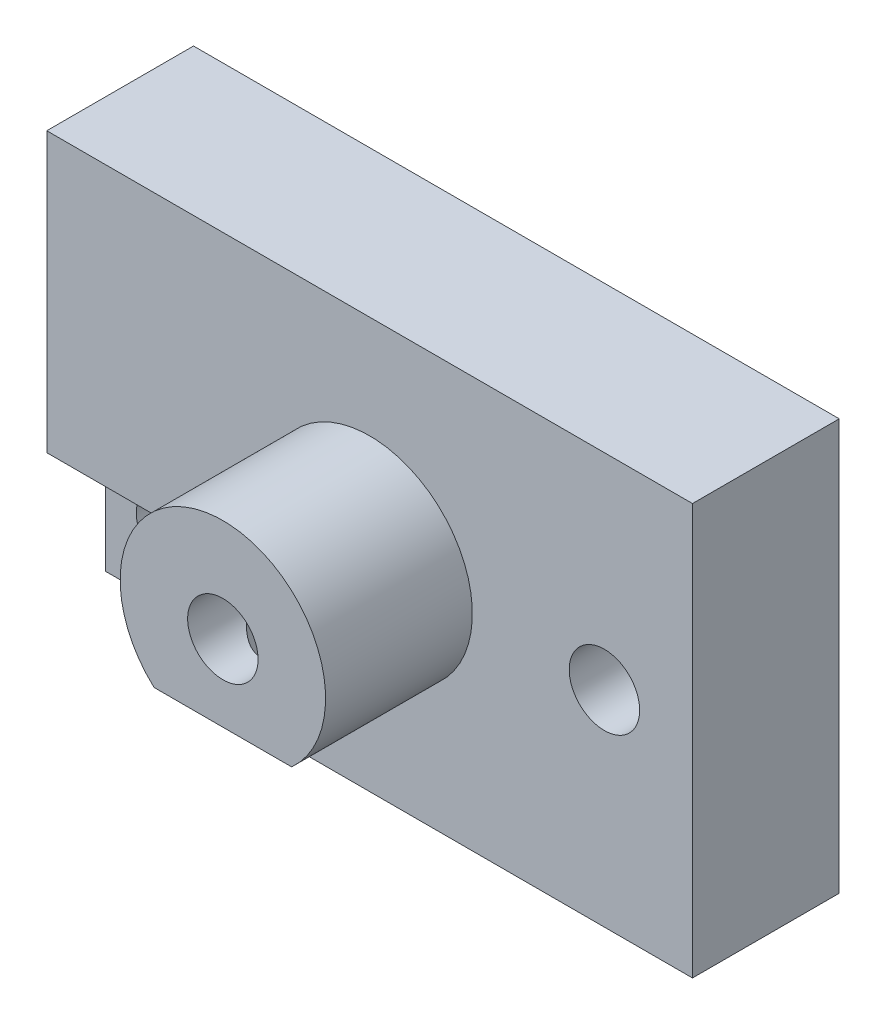
ISO-10303-21;
HEADER;
FILE_DESCRIPTION(('STEP AP214'),'2;1');
FILE_NAME('part.step','',(''),(''),'','','');
FILE_SCHEMA(('AUTOMOTIVE_DESIGN { 1 0 10303 214 1 1 1 1 }'));
ENDSEC;
DATA;
#1=APPLICATION_CONTEXT('core data for automotive mechanical design processes');
#2=APPLICATION_PROTOCOL_DEFINITION('international standard','automotive_design',2000,#1);
#3=PRODUCT_CONTEXT('',#1,'mechanical');
#4=PRODUCT('Part','Part','',(#3));
#5=PRODUCT_RELATED_PRODUCT_CATEGORY('part','',(#4));
#6=PRODUCT_DEFINITION_FORMATION('','',#4);
#7=PRODUCT_DEFINITION_CONTEXT('part definition',#1,'design');
#8=PRODUCT_DEFINITION('design','',#6,#7);
#9=PRODUCT_DEFINITION_SHAPE('','',#8);
#10=(LENGTH_UNIT() NAMED_UNIT(*) SI_UNIT(.MILLI.,.METRE.));
#11=(NAMED_UNIT(*) PLANE_ANGLE_UNIT() SI_UNIT($,.RADIAN.));
#12=(NAMED_UNIT(*) SI_UNIT($,.STERADIAN.) SOLID_ANGLE_UNIT());
#13=UNCERTAINTY_MEASURE_WITH_UNIT(LENGTH_MEASURE(1.E-05),#10,'distance_accuracy_value','');
#14=(GEOMETRIC_REPRESENTATION_CONTEXT(3) GLOBAL_UNCERTAINTY_ASSIGNED_CONTEXT((#13)) GLOBAL_UNIT_ASSIGNED_CONTEXT((#10,
#11,#12)) REPRESENTATION_CONTEXT('',''));
#15=CARTESIAN_POINT('',(0.,0.,0.));
#16=DIRECTION('',(0.,0.,1.));
#17=DIRECTION('',(1.,0.,0.));
#18=AXIS2_PLACEMENT_3D('',#15,#16,#17);
#19=CARTESIAN_POINT('',(0.,0.,25.));
#20=DIRECTION('',(0.,0.,-1.));
#21=DIRECTION('',(-1.,0.,0.));
#22=AXIS2_PLACEMENT_3D('',#19,#20,#21);
#23=PLANE('',#22);
#24=CARTESIAN_POINT('',(40.,0.,25.));
#25=DIRECTION('',(0.,0.,1.));
#26=DIRECTION('',(1.,0.,0.));
#27=AXIS2_PLACEMENT_3D('',#24,#25,#26);
#28=CIRCLE('',#27,5.99999999999999);
#29=CARTESIAN_POINT('',(46.,0.,25.));
#30=VERTEX_POINT('',#29);
#31=EDGE_CURVE('E127',#30,#30,#28,.T.);
#32=ORIENTED_EDGE('',*,*,#31,.F.);
#33=EDGE_LOOP('',(#32));
#34=FACE_BOUND('',#33,.T.);
#35=DIRECTION('',(-1.,0.,0.));
#36=VECTOR('',#35,1.);
#37=CARTESIAN_POINT('',(-77.5,-12.5,25.));
#38=LINE('',#37,#36);
#39=CARTESIAN_POINT('',(-32.5,-12.5,25.));
#40=VERTEX_POINT('',#39);
#41=CARTESIAN_POINT('',(-55.,-12.5,25.));
#42=VERTEX_POINT('',#41);
#43=EDGE_CURVE('E143',#40,#42,#38,.T.);
#44=ORIENTED_EDGE('',*,*,#43,.F.);
#45=DIRECTION('',(0.,1.,0.));
#46=VECTOR('',#45,1.);
#47=CARTESIAN_POINT('',(-32.5,-57.5,25.));
#48=LINE('',#47,#46);
#49=CARTESIAN_POINT('',(-32.5,-35.,25.));
#50=VERTEX_POINT('',#49);
#51=EDGE_CURVE('E137',#50,#40,#48,.T.);
#52=ORIENTED_EDGE('',*,*,#51,.F.);
#53=DIRECTION('',(1.,0.,0.));
#54=VECTOR('',#53,1.);
#55=CARTESIAN_POINT('',(-55.,-35.,25.));
#56=LINE('',#55,#54);
#57=CARTESIAN_POINT('',(55.,-35.,25.));
#58=VERTEX_POINT('',#57);
#59=EDGE_CURVE('E173',#50,#58,#56,.T.);
#60=ORIENTED_EDGE('',*,*,#59,.T.);
#61=DIRECTION('',(0.,1.,0.));
#62=VECTOR('',#61,1.);
#63=CARTESIAN_POINT('',(55.,-35.,25.));
#64=LINE('',#63,#62);
#65=CARTESIAN_POINT('',(55.,35.,25.));
#66=VERTEX_POINT('',#65);
#67=EDGE_CURVE('E164',#58,#66,#64,.T.);
#68=ORIENTED_EDGE('',*,*,#67,.T.);
#69=DIRECTION('',(-1.,0.,0.));
#70=VECTOR('',#69,1.);
#71=CARTESIAN_POINT('',(-55.,35.,25.));
#72=LINE('',#71,#70);
#73=CARTESIAN_POINT('',(-55.,35.,25.));
#74=VERTEX_POINT('',#73);
#75=EDGE_CURVE('E167',#66,#74,#72,.T.);
#76=ORIENTED_EDGE('',*,*,#75,.T.);
#77=DIRECTION('',(0.,-1.,0.));
#78=VECTOR('',#77,1.);
#79=CARTESIAN_POINT('',(-55.,-35.,25.));
#80=LINE('',#79,#78);
#81=EDGE_CURVE('E170',#74,#42,#80,.T.);
#82=ORIENTED_EDGE('',*,*,#81,.T.);
#83=EDGE_LOOP('',(#44,#52,#60,#68,#76,#82));
#84=FACE_BOUND('',#83,.T.);
#85=CARTESIAN_POINT('',(0.,0.,25.));
#86=DIRECTION('',(0.,0.,-1.));
#87=DIRECTION('',(-1.,0.,0.));
#88=AXIS2_PLACEMENT_3D('',#85,#86,#87);
#89=CIRCLE('',#88,17.5);
#90=CARTESIAN_POINT('',(11.71537451386,-13.,25.));
#91=VERTEX_POINT('',#90);
#92=CARTESIAN_POINT('',(-11.71537451386,-13.,25.));
#93=VERTEX_POINT('',#92);
#94=EDGE_CURVE('E194',#91,#93,#89,.F.);
#95=ORIENTED_EDGE('',*,*,#94,.F.);
#96=DIRECTION('',(-1.,0.,0.));
#97=VECTOR('',#96,1.);
#98=CARTESIAN_POINT('',(-11.71537451386,-13.,25.));
#99=LINE('',#98,#97);
#100=EDGE_CURVE('E120',#91,#93,#99,.T.);
#101=ORIENTED_EDGE('',*,*,#100,.T.);
#102=EDGE_LOOP('',(#95,#101));
#103=FACE_BOUND('',#102,.T.);
#104=ADVANCED_FACE('F33',(#34,#84,#103),#23,.F.);
#105=CARTESIAN_POINT('',(55.,-35.,25.));
#106=DIRECTION('',(-1.,0.,0.));
#107=DIRECTION('',(0.,0.,1.));
#108=AXIS2_PLACEMENT_3D('',#105,#106,#107);
#109=PLANE('',#108);
#110=DIRECTION('',(0.,1.,0.));
#111=VECTOR('',#110,1.);
#112=CARTESIAN_POINT('',(55.,-35.,0.));
#113=LINE('',#112,#111);
#114=CARTESIAN_POINT('',(55.,-35.,0.));
#115=VERTEX_POINT('',#114);
#116=CARTESIAN_POINT('',(55.,35.,0.));
#117=VERTEX_POINT('',#116);
#118=EDGE_CURVE('E163',#115,#117,#113,.T.);
#119=ORIENTED_EDGE('',*,*,#118,.T.);
#120=DIRECTION('',(0.,0.,-1.));
#121=VECTOR('',#120,1.);
#122=CARTESIAN_POINT('',(55.,35.,25.));
#123=LINE('',#122,#121);
#124=EDGE_CURVE('E191',#66,#117,#123,.T.);
#125=ORIENTED_EDGE('',*,*,#124,.F.);
#126=ORIENTED_EDGE('',*,*,#67,.F.);
#127=DIRECTION('',(0.,0.,-1.));
#128=VECTOR('',#127,1.);
#129=CARTESIAN_POINT('',(55.,-35.,25.));
#130=LINE('',#129,#128);
#131=EDGE_CURVE('E175',#58,#115,#130,.T.);
#132=ORIENTED_EDGE('',*,*,#131,.T.);
#133=EDGE_LOOP('',(#119,#125,#126,#132));
#134=FACE_BOUND('',#133,.T.);
#135=ADVANCED_FACE('F35',(#134),#109,.F.);
#136=CARTESIAN_POINT('',(-55.,35.,25.));
#137=DIRECTION('',(0.,-1.,0.));
#138=DIRECTION('',(0.,0.,-1.));
#139=AXIS2_PLACEMENT_3D('',#136,#137,#138);
#140=PLANE('',#139);
#141=DIRECTION('',(-1.,0.,0.));
#142=VECTOR('',#141,1.);
#143=CARTESIAN_POINT('',(-55.,35.,0.));
#144=LINE('',#143,#142);
#145=CARTESIAN_POINT('',(-55.,35.,0.));
#146=VERTEX_POINT('',#145);
#147=EDGE_CURVE('E178',#117,#146,#144,.T.);
#148=ORIENTED_EDGE('',*,*,#147,.T.);
#149=DIRECTION('',(0.,0.,-1.));
#150=VECTOR('',#149,1.);
#151=CARTESIAN_POINT('',(-55.,35.,25.));
#152=LINE('',#151,#150);
#153=EDGE_CURVE('E188',#74,#146,#152,.T.);
#154=ORIENTED_EDGE('',*,*,#153,.F.);
#155=ORIENTED_EDGE('',*,*,#75,.F.);
#156=ORIENTED_EDGE('',*,*,#124,.T.);
#157=EDGE_LOOP('',(#148,#154,#155,#156));
#158=FACE_BOUND('',#157,.T.);
#159=ADVANCED_FACE('F241',(#158),#140,.F.);
#160=CARTESIAN_POINT('',(-55.,-35.,25.));
#161=DIRECTION('',(1.,0.,0.));
#162=DIRECTION('',(0.,0.,-1.));
#163=AXIS2_PLACEMENT_3D('',#160,#161,#162);
#164=PLANE('',#163);
#165=DIRECTION('',(0.,1.,0.));
#166=VECTOR('',#165,1.);
#167=CARTESIAN_POINT('',(-55.,-35.,15.));
#168=LINE('',#167,#166);
#169=CARTESIAN_POINT('',(-55.,-35.,15.));
#170=VERTEX_POINT('',#169);
#171=CARTESIAN_POINT('',(-55.,-12.5,15.));
#172=VERTEX_POINT('',#171);
#173=EDGE_CURVE('E151',#170,#172,#168,.T.);
#174=ORIENTED_EDGE('',*,*,#173,.T.);
#175=DIRECTION('',(0.,0.,1.));
#176=VECTOR('',#175,1.);
#177=CARTESIAN_POINT('',(-55.,-12.5,25.));
#178=LINE('',#177,#176);
#179=EDGE_CURVE('E11',#172,#42,#178,.T.);
#180=ORIENTED_EDGE('',*,*,#179,.T.);
#181=ORIENTED_EDGE('',*,*,#81,.F.);
#182=ORIENTED_EDGE('',*,*,#153,.T.);
#183=DIRECTION('',(0.,-1.,0.));
#184=VECTOR('',#183,1.);
#185=CARTESIAN_POINT('',(-55.,-35.,0.));
#186=LINE('',#185,#184);
#187=CARTESIAN_POINT('',(-55.,-35.,0.));
#188=VERTEX_POINT('',#187);
#189=EDGE_CURVE('E180',#146,#188,#186,.T.);
#190=ORIENTED_EDGE('',*,*,#189,.T.);
#191=DIRECTION('',(0.,0.,-1.));
#192=VECTOR('',#191,1.);
#193=CARTESIAN_POINT('',(-55.,-35.,25.));
#194=LINE('',#193,#192);
#195=EDGE_CURVE('E186',#170,#188,#194,.T.);
#196=ORIENTED_EDGE('',*,*,#195,.F.);
#197=EDGE_LOOP('',(#174,#180,#181,#182,#190,#196));
#198=FACE_BOUND('',#197,.T.);
#199=ADVANCED_FACE('F218',(#198),#164,.F.);
#200=CARTESIAN_POINT('',(-55.,-35.,25.));
#201=DIRECTION('',(0.,1.,0.));
#202=DIRECTION('',(0.,0.,1.));
#203=AXIS2_PLACEMENT_3D('',#200,#201,#202);
#204=PLANE('',#203);
#205=ORIENTED_EDGE('',*,*,#59,.F.);
#206=DIRECTION('',(0.,0.,-1.));
#207=VECTOR('',#206,1.);
#208=CARTESIAN_POINT('',(-32.5,-35.,25.));
#209=LINE('',#208,#207);
#210=CARTESIAN_POINT('',(-32.5,-35.,15.));
#211=VERTEX_POINT('',#210);
#212=EDGE_CURVE('E41',#50,#211,#209,.T.);
#213=ORIENTED_EDGE('',*,*,#212,.T.);
#214=DIRECTION('',(-1.,0.,0.));
#215=VECTOR('',#214,1.);
#216=CARTESIAN_POINT('',(-55.,-35.,15.));
#217=LINE('',#216,#215);
#218=EDGE_CURVE('E197',#211,#170,#217,.T.);
#219=ORIENTED_EDGE('',*,*,#218,.T.);
#220=ORIENTED_EDGE('',*,*,#195,.T.);
#221=DIRECTION('',(1.,0.,0.));
#222=VECTOR('',#221,1.);
#223=CARTESIAN_POINT('',(-55.,-35.,0.));
#224=LINE('',#223,#222);
#225=EDGE_CURVE('E168',#188,#115,#224,.T.);
#226=ORIENTED_EDGE('',*,*,#225,.T.);
#227=ORIENTED_EDGE('',*,*,#131,.F.);
#228=EDGE_LOOP('',(#205,#213,#219,#220,#226,#227));
#229=FACE_BOUND('',#228,.T.);
#230=ADVANCED_FACE('F202',(#229),#204,.F.);
#231=CARTESIAN_POINT('',(0.,0.,0.));
#232=DIRECTION('',(0.,0.,-1.));
#233=DIRECTION('',(-1.,0.,0.));
#234=AXIS2_PLACEMENT_3D('',#231,#232,#233);
#235=PLANE('',#234);
#236=CARTESIAN_POINT('',(40.,0.,0.));
#237=DIRECTION('',(0.,0.,1.));
#238=DIRECTION('',(1.,0.,0.));
#239=AXIS2_PLACEMENT_3D('',#236,#237,#238);
#240=CIRCLE('',#239,5.99999999999999);
#241=CARTESIAN_POINT('',(46.,0.,0.));
#242=VERTEX_POINT('',#241);
#243=EDGE_CURVE('E128',#242,#242,#240,.T.);
#244=ORIENTED_EDGE('',*,*,#243,.T.);
#245=EDGE_LOOP('',(#244));
#246=FACE_BOUND('',#245,.T.);
#247=CARTESIAN_POINT('',(-43.75,-23.75,0.));
#248=DIRECTION('',(0.,0.,1.));
#249=DIRECTION('',(1.,0.,0.));
#250=AXIS2_PLACEMENT_3D('',#247,#248,#249);
#251=CIRCLE('',#250,6.);
#252=CARTESIAN_POINT('',(-37.75,-23.75,0.));
#253=VERTEX_POINT('',#252);
#254=EDGE_CURVE('E134',#253,#253,#251,.T.);
#255=ORIENTED_EDGE('',*,*,#254,.T.);
#256=EDGE_LOOP('',(#255));
#257=FACE_BOUND('',#256,.T.);
#258=CARTESIAN_POINT('',(0.,0.,0.));
#259=DIRECTION('',(0.,0.,1.));
#260=DIRECTION('',(1.,0.,0.));
#261=AXIS2_PLACEMENT_3D('',#258,#259,#260);
#262=CIRCLE('',#261,6.);
#263=CARTESIAN_POINT('',(6.,0.,0.));
#264=VERTEX_POINT('',#263);
#265=EDGE_CURVE('E155',#264,#264,#262,.T.);
#266=ORIENTED_EDGE('',*,*,#265,.T.);
#267=EDGE_LOOP('',(#266));
#268=FACE_BOUND('',#267,.T.);
#269=ORIENTED_EDGE('',*,*,#118,.F.);
#270=ORIENTED_EDGE('',*,*,#225,.F.);
#271=ORIENTED_EDGE('',*,*,#189,.F.);
#272=ORIENTED_EDGE('',*,*,#147,.F.);
#273=EDGE_LOOP('',(#269,#270,#271,#272));
#274=FACE_BOUND('',#273,.T.);
#275=ADVANCED_FACE('F248',(#246,#257,#268,#274),#235,.T.);
#276=CARTESIAN_POINT('',(0.,0.,50.));
#277=DIRECTION('',(0.,0.,-1.));
#278=DIRECTION('',(-1.,0.,0.));
#279=AXIS2_PLACEMENT_3D('',#276,#277,#278);
#280=CYLINDRICAL_SURFACE('',#279,17.5);
#281=CARTESIAN_POINT('',(0.,0.,50.));
#282=DIRECTION('',(0.,0.,1.));
#283=DIRECTION('',(1.,0.,0.));
#284=AXIS2_PLACEMENT_3D('',#281,#282,#283);
#285=CIRCLE('',#284,17.5);
#286=CARTESIAN_POINT('',(11.71537451386,-13.,50.));
#287=VERTEX_POINT('',#286);
#288=CARTESIAN_POINT('',(-11.71537451386,-13.,50.));
#289=VERTEX_POINT('',#288);
#290=EDGE_CURVE('E158',#287,#289,#285,.T.);
#291=ORIENTED_EDGE('',*,*,#290,.F.);
#292=DIRECTION('',(0.,0.,1.));
#293=VECTOR('',#292,1.);
#294=CARTESIAN_POINT('',(11.71537451386,-13.,1.14103941911969));
#295=LINE('',#294,#293);
#296=EDGE_CURVE('E55',#91,#287,#295,.T.);
#297=ORIENTED_EDGE('',*,*,#296,.F.);
#298=ORIENTED_EDGE('',*,*,#94,.T.);
#299=DIRECTION('',(0.,0.,1.));
#300=VECTOR('',#299,1.);
#301=CARTESIAN_POINT('',(-11.71537451386,-13.,1.14103941911969));
#302=LINE('',#301,#300);
#303=EDGE_CURVE('E123',#93,#289,#302,.T.);
#304=ORIENTED_EDGE('',*,*,#303,.T.);
#305=EDGE_LOOP('',(#291,#297,#298,#304));
#306=FACE_BOUND('',#305,.T.);
#307=ADVANCED_FACE('F246',(#306),#280,.T.);
#308=CARTESIAN_POINT('',(0.,0.,50.));
#309=DIRECTION('',(0.,0.,1.));
#310=DIRECTION('',(1.,0.,0.));
#311=AXIS2_PLACEMENT_3D('',#308,#309,#310);
#312=PLANE('',#311);
#313=DIRECTION('',(-1.,0.,0.));
#314=VECTOR('',#313,1.);
#315=CARTESIAN_POINT('',(-11.71537451386,-13.,50.));
#316=LINE('',#315,#314);
#317=EDGE_CURVE('E116',#287,#289,#316,.T.);
#318=ORIENTED_EDGE('',*,*,#317,.F.);
#319=ORIENTED_EDGE('',*,*,#290,.T.);
#320=EDGE_LOOP('',(#318,#319));
#321=FACE_BOUND('',#320,.T.);
#322=CARTESIAN_POINT('',(0.,0.,50.));
#323=DIRECTION('',(0.,0.,1.));
#324=DIRECTION('',(1.,0.,0.));
#325=AXIS2_PLACEMENT_3D('',#322,#323,#324);
#326=CIRCLE('',#325,6.);
#327=CARTESIAN_POINT('',(6.,0.,50.));
#328=VERTEX_POINT('',#327);
#329=EDGE_CURVE('E154',#328,#328,#326,.T.);
#330=ORIENTED_EDGE('',*,*,#329,.F.);
#331=EDGE_LOOP('',(#330));
#332=FACE_BOUND('',#331,.T.);
#333=ADVANCED_FACE('F289',(#321,#332),#312,.T.);
#334=CARTESIAN_POINT('',(0.,0.,0.));
#335=DIRECTION('',(0.,0.,1.));
#336=DIRECTION('',(1.,0.,0.));
#337=AXIS2_PLACEMENT_3D('',#334,#335,#336);
#338=CYLINDRICAL_SURFACE('',#337,6.);
#339=CARTESIAN_POINT('',(0.,0.,37.5));
#340=DIRECTION('',(0.,-0.707106781186547,-0.707106781186547));
#341=DIRECTION('',(0.,-0.707106781186547,0.707106781186547));
#342=AXIS2_PLACEMENT_3D('',#339,#340,#341);
#343=ELLIPSE('',#342,8.48528137423857,6.);
#344=CARTESIAN_POINT('',(-6.,0.,37.5));
#345=VERTEX_POINT('',#344);
#346=CARTESIAN_POINT('',(6.,0.,37.5));
#347=VERTEX_POINT('',#346);
#348=EDGE_CURVE('E107',#345,#347,#343,.F.);
#349=ORIENTED_EDGE('',*,*,#348,.F.);
#350=CARTESIAN_POINT('',(0.,0.,37.5));
#351=DIRECTION('',(0.,-0.707106781186547,0.707106781186547));
#352=DIRECTION('',(0.,-0.707106781186547,-0.707106781186547));
#353=AXIS2_PLACEMENT_3D('',#350,#351,#352);
#354=ELLIPSE('',#353,8.48528137423857,6.);
#355=EDGE_CURVE('E47',#347,#345,#354,.F.);
#356=ORIENTED_EDGE('',*,*,#355,.F.);
#357=EDGE_LOOP('',(#349,#356));
#358=FACE_BOUND('',#357,.T.);
#359=ORIENTED_EDGE('',*,*,#265,.F.);
#360=EDGE_LOOP('',(#359));
#361=FACE_BOUND('',#360,.T.);
#362=ORIENTED_EDGE('',*,*,#329,.T.);
#363=EDGE_LOOP('',(#362));
#364=FACE_BOUND('',#363,.T.);
#365=ADVANCED_FACE('F111',(#358,#361,#364),#338,.F.);
#366=CARTESIAN_POINT('',(-77.5,-12.5,15.));
#367=DIRECTION('',(0.,1.,0.));
#368=DIRECTION('',(0.,0.,1.));
#369=AXIS2_PLACEMENT_3D('',#366,#367,#368);
#370=PLANE('',#369);
#371=DIRECTION('',(-1.,0.,0.));
#372=VECTOR('',#371,1.);
#373=CARTESIAN_POINT('',(-77.5,-12.5,15.));
#374=LINE('',#373,#372);
#375=CARTESIAN_POINT('',(-32.5,-12.5,15.));
#376=VERTEX_POINT('',#375);
#377=EDGE_CURVE('E142',#376,#172,#374,.T.);
#378=ORIENTED_EDGE('',*,*,#377,.F.);
#379=DIRECTION('',(0.,0.,1.));
#380=VECTOR('',#379,1.);
#381=CARTESIAN_POINT('',(-32.5,-12.5,15.));
#382=LINE('',#381,#380);
#383=EDGE_CURVE('E146',#376,#40,#382,.T.);
#384=ORIENTED_EDGE('',*,*,#383,.T.);
#385=ORIENTED_EDGE('',*,*,#43,.T.);
#386=ORIENTED_EDGE('',*,*,#179,.F.);
#387=EDGE_LOOP('',(#378,#384,#385,#386));
#388=FACE_BOUND('',#387,.T.);
#389=ADVANCED_FACE('F216',(#388),#370,.F.);
#390=CARTESIAN_POINT('',(-32.5,-57.5,15.));
#391=DIRECTION('',(1.,0.,0.));
#392=DIRECTION('',(0.,0.,-1.));
#393=AXIS2_PLACEMENT_3D('',#390,#391,#392);
#394=PLANE('',#393);
#395=ORIENTED_EDGE('',*,*,#51,.T.);
#396=ORIENTED_EDGE('',*,*,#383,.F.);
#397=DIRECTION('',(0.,1.,0.));
#398=VECTOR('',#397,1.);
#399=CARTESIAN_POINT('',(-32.5,-57.5,15.));
#400=LINE('',#399,#398);
#401=EDGE_CURVE('E140',#211,#376,#400,.T.);
#402=ORIENTED_EDGE('',*,*,#401,.F.);
#403=ORIENTED_EDGE('',*,*,#212,.F.);
#404=EDGE_LOOP('',(#395,#396,#402,#403));
#405=FACE_BOUND('',#404,.T.);
#406=ADVANCED_FACE('F208',(#405),#394,.F.);
#407=CARTESIAN_POINT('',(0.,0.,15.));
#408=DIRECTION('',(0.,0.,-1.));
#409=DIRECTION('',(-1.,0.,0.));
#410=AXIS2_PLACEMENT_3D('',#407,#408,#409);
#411=PLANE('',#410);
#412=CARTESIAN_POINT('',(-43.75,-23.75,15.));
#413=DIRECTION('',(0.,0.,1.));
#414=DIRECTION('',(1.,0.,0.));
#415=AXIS2_PLACEMENT_3D('',#412,#413,#414);
#416=CIRCLE('',#415,6.);
#417=CARTESIAN_POINT('',(-37.75,-23.75,15.));
#418=VERTEX_POINT('',#417);
#419=EDGE_CURVE('E131',#418,#418,#416,.T.);
#420=ORIENTED_EDGE('',*,*,#419,.F.);
#421=EDGE_LOOP('',(#420));
#422=FACE_BOUND('',#421,.T.);
#423=ORIENTED_EDGE('',*,*,#218,.F.);
#424=ORIENTED_EDGE('',*,*,#401,.T.);
#425=ORIENTED_EDGE('',*,*,#377,.T.);
#426=ORIENTED_EDGE('',*,*,#173,.F.);
#427=EDGE_LOOP('',(#423,#424,#425,#426));
#428=FACE_BOUND('',#427,.T.);
#429=ADVANCED_FACE('F220',(#422,#428),#411,.F.);
#430=CARTESIAN_POINT('',(-43.75,-23.75,0.));
#431=DIRECTION('',(0.,0.,1.));
#432=DIRECTION('',(1.,0.,0.));
#433=AXIS2_PLACEMENT_3D('',#430,#431,#432);
#434=CYLINDRICAL_SURFACE('',#433,6.);
#435=CARTESIAN_POINT('',(-37.75,-23.75,0.));
#436=CARTESIAN_POINT('',(-37.75,-23.75,0.15625));
#437=CARTESIAN_POINT('',(-37.75,-23.75,0.3125));
#438=CARTESIAN_POINT('',(-37.75,-23.75,0.625));
#439=CARTESIAN_POINT('',(-37.75,-23.75,0.78125));
#440=CARTESIAN_POINT('',(-37.75,-23.75,1.09375));
#441=CARTESIAN_POINT('',(-37.75,-23.75,1.25));
#442=CARTESIAN_POINT('',(-37.75,-23.75,1.5625));
#443=CARTESIAN_POINT('',(-37.75,-23.75,1.71875));
#444=CARTESIAN_POINT('',(-37.75,-23.75,2.03125));
#445=CARTESIAN_POINT('',(-37.75,-23.75,2.1875));
#446=CARTESIAN_POINT('',(-37.75,-23.75,2.5));
#447=CARTESIAN_POINT('',(-37.75,-23.75,2.65625));
#448=CARTESIAN_POINT('',(-37.75,-23.75,2.96875));
#449=CARTESIAN_POINT('',(-37.75,-23.75,3.125));
#450=CARTESIAN_POINT('',(-37.75,-23.75,3.4375));
#451=CARTESIAN_POINT('',(-37.75,-23.75,3.59375));
#452=CARTESIAN_POINT('',(-37.75,-23.75,3.90625));
#453=CARTESIAN_POINT('',(-37.75,-23.75,4.0625));
#454=CARTESIAN_POINT('',(-37.75,-23.75,4.375));
#455=CARTESIAN_POINT('',(-37.75,-23.75,4.53125));
#456=CARTESIAN_POINT('',(-37.75,-23.75,4.84375));
#457=CARTESIAN_POINT('',(-37.75,-23.75,5.));
#458=CARTESIAN_POINT('',(-37.75,-23.75,5.3125));
#459=CARTESIAN_POINT('',(-37.75,-23.75,5.46875));
#460=CARTESIAN_POINT('',(-37.75,-23.75,5.78125));
#461=CARTESIAN_POINT('',(-37.75,-23.75,5.9375));
#462=CARTESIAN_POINT('',(-37.75,-23.75,6.25));
#463=CARTESIAN_POINT('',(-37.75,-23.75,6.40625));
#464=CARTESIAN_POINT('',(-37.75,-23.75,6.71875));
#465=CARTESIAN_POINT('',(-37.75,-23.75,6.875));
#466=CARTESIAN_POINT('',(-37.75,-23.75,7.1875));
#467=CARTESIAN_POINT('',(-37.75,-23.75,7.34375));
#468=CARTESIAN_POINT('',(-37.75,-23.75,7.65625));
#469=CARTESIAN_POINT('',(-37.75,-23.75,7.8125));
#470=CARTESIAN_POINT('',(-37.75,-23.75,8.125));
#471=CARTESIAN_POINT('',(-37.75,-23.75,8.28125));
#472=CARTESIAN_POINT('',(-37.75,-23.75,8.59375));
#473=CARTESIAN_POINT('',(-37.75,-23.75,8.75));
#474=CARTESIAN_POINT('',(-37.75,-23.75,9.0625));
#475=CARTESIAN_POINT('',(-37.75,-23.75,9.21875));
#476=CARTESIAN_POINT('',(-37.75,-23.75,9.53125));
#477=CARTESIAN_POINT('',(-37.75,-23.75,9.6875));
#478=CARTESIAN_POINT('',(-37.75,-23.75,10.));
#479=CARTESIAN_POINT('',(-37.75,-23.75,10.15625));
#480=CARTESIAN_POINT('',(-37.75,-23.75,10.46875));
#481=CARTESIAN_POINT('',(-37.75,-23.75,10.625));
#482=CARTESIAN_POINT('',(-37.75,-23.75,10.9375));
#483=CARTESIAN_POINT('',(-37.75,-23.75,11.09375));
#484=CARTESIAN_POINT('',(-37.75,-23.75,11.40625));
#485=CARTESIAN_POINT('',(-37.75,-23.75,11.5625));
#486=CARTESIAN_POINT('',(-37.75,-23.75,11.875));
#487=CARTESIAN_POINT('',(-37.75,-23.75,12.03125));
#488=CARTESIAN_POINT('',(-37.75,-23.75,12.34375));
#489=CARTESIAN_POINT('',(-37.75,-23.75,12.5));
#490=CARTESIAN_POINT('',(-37.75,-23.75,12.8125));
#491=CARTESIAN_POINT('',(-37.75,-23.75,12.96875));
#492=CARTESIAN_POINT('',(-37.75,-23.75,13.28125));
#493=CARTESIAN_POINT('',(-37.75,-23.75,13.4375));
#494=CARTESIAN_POINT('',(-37.75,-23.75,13.75));
#495=CARTESIAN_POINT('',(-37.75,-23.75,13.90625));
#496=CARTESIAN_POINT('',(-37.75,-23.75,14.21875));
#497=CARTESIAN_POINT('',(-37.75,-23.75,14.375));
#498=CARTESIAN_POINT('',(-37.75,-23.75,14.6875));
#499=CARTESIAN_POINT('',(-37.75,-23.75,14.84375));
#500=CARTESIAN_POINT('',(-37.75,-23.75,15.));
#501=B_SPLINE_CURVE_WITH_KNOTS('',3,(#435,#436,#437,#438,#439,#440,#441,#442,#443,#444,#445,
#446,#447,#448,#449,#450,#451,#452,#453,#454,#455,#456,#457,#458,#459,#460,#461,#462,#463,#464,
#465,#466,#467,#468,#469,#470,#471,#472,#473,#474,#475,#476,#477,#478,#479,#480,#481,#482,#483,
#484,#485,#486,#487,#488,#489,#490,#491,#492,#493,#494,#495,#496,#497,#498,#499,#500),
.UNSPECIFIED.,.F.,.F.,(4,2,2,2,2,2,2,2,2,2,2,2,2,2,2,2,2,2,2,2,2,2,2,2,2,2,2,2,2,2,2,2,4),(0.,
0.46875,0.9375,1.40625,1.875,2.34375,2.8125,3.28125,3.75,4.21875,4.6875,5.15625,5.625,6.09375,
6.5625,7.03125,7.5,7.96875,8.4375,8.90625,9.375,9.84375,10.3125,10.78125,11.25,11.71875,12.1875,
12.65625,13.125,13.59375,14.0625,14.53125,15.),.UNSPECIFIED.);
#502=EDGE_CURVE('BSEAM222',#253,#418,#501,.T.);
#503=ORIENTED_EDGE('',*,*,#254,.F.);
#504=ORIENTED_EDGE('',*,*,#419,.T.);
#505=ORIENTED_EDGE('',*,*,#502,.T.);
#506=ORIENTED_EDGE('',*,*,#502,.F.);
#507=EDGE_LOOP('',(#503,#505,#504,#506));
#508=FACE_BOUND('',#507,.T.);
#509=ADVANCED_FACE('F222',(#508),#434,.F.);
#510=CARTESIAN_POINT('',(40.,0.,0.));
#511=DIRECTION('',(0.,0.,1.));
#512=DIRECTION('',(1.,0.,0.));
#513=AXIS2_PLACEMENT_3D('',#510,#511,#512);
#514=CYLINDRICAL_SURFACE('',#513,5.99999999999999);
#515=ORIENTED_EDGE('',*,*,#243,.F.);
#516=EDGE_LOOP('',(#515));
#517=FACE_BOUND('',#516,.T.);
#518=ORIENTED_EDGE('',*,*,#31,.T.);
#519=EDGE_LOOP('',(#518));
#520=FACE_BOUND('',#519,.T.);
#521=ADVANCED_FACE('F229',(#517,#520),#514,.F.);
#522=CARTESIAN_POINT('',(-11.71537451386,-13.,1.14103941911969));
#523=DIRECTION('',(0.,1.,0.));
#524=DIRECTION('',(0.,0.,1.));
#525=AXIS2_PLACEMENT_3D('',#522,#523,#524);
#526=PLANE('',#525);
#527=CARTESIAN_POINT('',(0.,-13.,37.5));
#528=DIRECTION('',(0.,-1.,0.));
#529=DIRECTION('',(0.,0.,-1.));
#530=AXIS2_PLACEMENT_3D('',#527,#528,#529);
#531=CIRCLE('',#530,6.);
#532=CARTESIAN_POINT('',(0.,-13.,31.5));
#533=VERTEX_POINT('',#532);
#534=EDGE_CURVE('E113',#533,#533,#531,.T.);
#535=ORIENTED_EDGE('',*,*,#534,.F.);
#536=EDGE_LOOP('',(#535));
#537=FACE_BOUND('',#536,.T.);
#538=ORIENTED_EDGE('',*,*,#296,.T.);
#539=ORIENTED_EDGE('',*,*,#317,.T.);
#540=ORIENTED_EDGE('',*,*,#303,.F.);
#541=ORIENTED_EDGE('',*,*,#100,.F.);
#542=EDGE_LOOP('',(#538,#539,#540,#541));
#543=FACE_BOUND('',#542,.T.);
#544=ADVANCED_FACE('F328',(#537,#543),#526,.F.);
#545=CARTESIAN_POINT('',(0.,35.001,37.5));
#546=DIRECTION('',(0.,-1.,0.));
#547=DIRECTION('',(0.,0.,-1.));
#548=AXIS2_PLACEMENT_3D('',#545,#546,#547);
#549=CYLINDRICAL_SURFACE('',#548,6.);
#550=ORIENTED_EDGE('',*,*,#534,.T.);
#551=EDGE_LOOP('',(#550));
#552=FACE_BOUND('',#551,.T.);
#553=ORIENTED_EDGE('',*,*,#355,.T.);
#554=ORIENTED_EDGE('',*,*,#348,.T.);
#555=EDGE_LOOP('',(#553,#554));
#556=FACE_BOUND('',#555,.T.);
#557=ADVANCED_FACE('F108',(#552,#556),#549,.F.);
#558=CLOSED_SHELL('',(#104,#135,#159,#199,#230,#275,#307,#333,#365,#389,#406,#429,#509,#521,
#544,#557));
#559=MANIFOLD_SOLID_BREP('B2',#558);
#560=ADVANCED_BREP_SHAPE_REPRESENTATION('',(#18,#559),#14);
#561=SHAPE_DEFINITION_REPRESENTATION(#9,#560);
ENDSEC;
END-ISO-10303-21;
